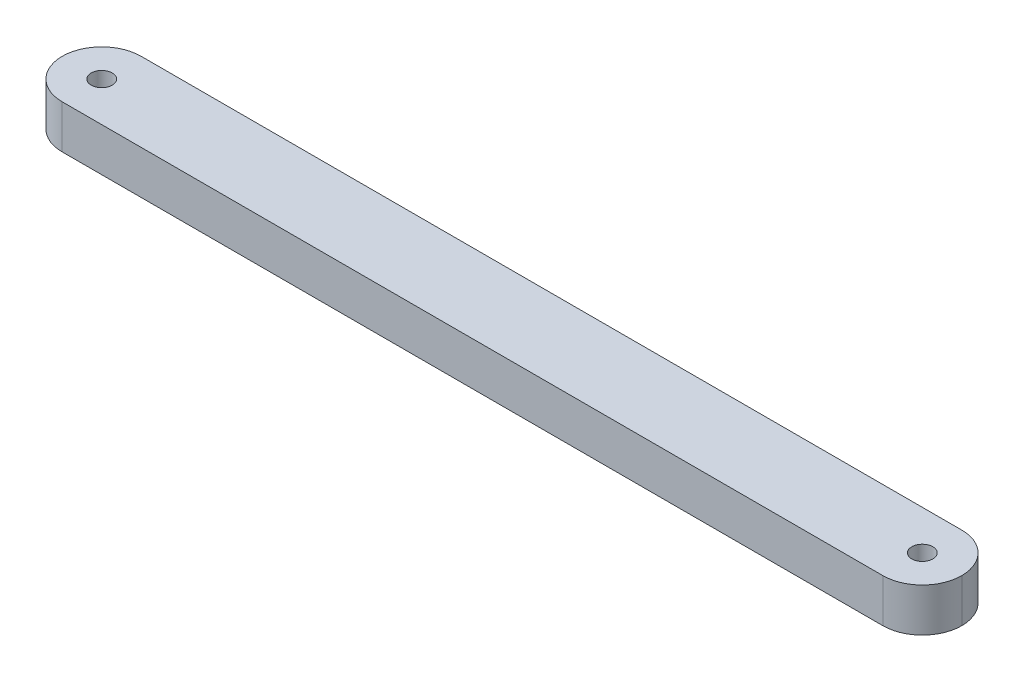
ISO-10303-21;
HEADER;
FILE_DESCRIPTION(('STEP AP214'),'2;1');
FILE_NAME('part.step','',(''),(''),'','','');
FILE_SCHEMA(('AUTOMOTIVE_DESIGN { 1 0 10303 214 1 1 1 1 }'));
ENDSEC;
DATA;
#1=APPLICATION_CONTEXT('core data for automotive mechanical design processes');
#2=APPLICATION_PROTOCOL_DEFINITION('international standard','automotive_design',2000,#1);
#3=PRODUCT_CONTEXT('',#1,'mechanical');
#4=PRODUCT('Part','Part','',(#3));
#5=PRODUCT_RELATED_PRODUCT_CATEGORY('part','',(#4));
#6=PRODUCT_DEFINITION_FORMATION('','',#4);
#7=PRODUCT_DEFINITION_CONTEXT('part definition',#1,'design');
#8=PRODUCT_DEFINITION('design','',#6,#7);
#9=PRODUCT_DEFINITION_SHAPE('','',#8);
#10=(LENGTH_UNIT() NAMED_UNIT(*) SI_UNIT(.MILLI.,.METRE.));
#11=(NAMED_UNIT(*) PLANE_ANGLE_UNIT() SI_UNIT($,.RADIAN.));
#12=(NAMED_UNIT(*) SI_UNIT($,.STERADIAN.) SOLID_ANGLE_UNIT());
#13=UNCERTAINTY_MEASURE_WITH_UNIT(LENGTH_MEASURE(1.E-05),#10,'distance_accuracy_value','');
#14=(GEOMETRIC_REPRESENTATION_CONTEXT(3) GLOBAL_UNCERTAINTY_ASSIGNED_CONTEXT((#13)) GLOBAL_UNIT_ASSIGNED_CONTEXT((#10,
#11,#12)) REPRESENTATION_CONTEXT('',''));
#15=CARTESIAN_POINT('',(0.,0.,0.));
#16=DIRECTION('',(0.,0.,1.));
#17=DIRECTION('',(1.,0.,0.));
#18=AXIS2_PLACEMENT_3D('',#15,#16,#17);
#19=CARTESIAN_POINT('',(0.,6.985,6.35000000000002));
#20=DIRECTION('',(0.,0.,-1.));
#21=DIRECTION('',(-1.,0.,0.));
#22=AXIS2_PLACEMENT_3D('',#19,#20,#21);
#23=PLANE('',#22);
#24=DIRECTION('',(1.,0.,0.));
#25=VECTOR('',#24,1.);
#26=CARTESIAN_POINT('',(0.,6.985,6.35000000000002));
#27=LINE('',#26,#25);
#28=CARTESIAN_POINT('',(-66.04,6.985,6.35000000000002));
#29=VERTEX_POINT('',#28);
#30=CARTESIAN_POINT('',(66.04,6.985,6.35000000000003));
#31=VERTEX_POINT('',#30);
#32=EDGE_CURVE('E122',#29,#31,#27,.T.);
#33=ORIENTED_EDGE('',*,*,#32,.F.);
#34=DIRECTION('',(0.,-1.,0.));
#35=VECTOR('',#34,1.);
#36=CARTESIAN_POINT('',(-66.04,0.,6.35000000000002));
#37=LINE('',#36,#35);
#38=CARTESIAN_POINT('',(-66.04,0.,6.35000000000002));
#39=VERTEX_POINT('',#38);
#40=EDGE_CURVE('E106',#29,#39,#37,.T.);
#41=ORIENTED_EDGE('',*,*,#40,.T.);
#42=DIRECTION('',(1.,0.,0.));
#43=VECTOR('',#42,1.);
#44=CARTESIAN_POINT('',(0.,0.,6.35000000000002));
#45=LINE('',#44,#43);
#46=CARTESIAN_POINT('',(66.04,0.,6.35000000000003));
#47=VERTEX_POINT('',#46);
#48=EDGE_CURVE('E119',#39,#47,#45,.T.);
#49=ORIENTED_EDGE('',*,*,#48,.T.);
#50=DIRECTION('',(0.,-1.,0.));
#51=VECTOR('',#50,1.);
#52=CARTESIAN_POINT('',(66.04,6.985,6.35000000000003));
#53=LINE('',#52,#51);
#54=EDGE_CURVE('E124',#47,#31,#53,.F.);
#55=ORIENTED_EDGE('',*,*,#54,.T.);
#56=EDGE_LOOP('',(#33,#41,#49,#55));
#57=FACE_BOUND('',#56,.T.);
#58=ADVANCED_FACE('F47',(#57),#23,.F.);
#59=CARTESIAN_POINT('',(0.,6.985,-6.34999999999999));
#60=DIRECTION('',(0.,0.,-1.));
#61=DIRECTION('',(-1.,0.,0.));
#62=AXIS2_PLACEMENT_3D('',#59,#60,#61);
#63=PLANE('',#62);
#64=DIRECTION('',(1.,0.,0.));
#65=VECTOR('',#64,1.);
#66=CARTESIAN_POINT('',(0.,6.985,-6.34999999999999));
#67=LINE('',#66,#65);
#68=CARTESIAN_POINT('',(-66.04,6.985,-6.34999999999999));
#69=VERTEX_POINT('',#68);
#70=CARTESIAN_POINT('',(66.04,6.985,-6.35));
#71=VERTEX_POINT('',#70);
#72=EDGE_CURVE('E172',#69,#71,#67,.T.);
#73=ORIENTED_EDGE('',*,*,#72,.T.);
#74=DIRECTION('',(0.,-1.,0.));
#75=VECTOR('',#74,1.);
#76=CARTESIAN_POINT('',(66.04,0.,-6.35));
#77=LINE('',#76,#75);
#78=CARTESIAN_POINT('',(66.04,0.,-6.35));
#79=VERTEX_POINT('',#78);
#80=EDGE_CURVE('E11',#71,#79,#77,.T.);
#81=ORIENTED_EDGE('',*,*,#80,.T.);
#82=DIRECTION('',(1.,0.,0.));
#83=VECTOR('',#82,1.);
#84=CARTESIAN_POINT('',(0.,0.,-6.34999999999999));
#85=LINE('',#84,#83);
#86=CARTESIAN_POINT('',(-66.04,0.,-6.34999999999999));
#87=VERTEX_POINT('',#86);
#88=EDGE_CURVE('E131',#87,#79,#85,.T.);
#89=ORIENTED_EDGE('',*,*,#88,.F.);
#90=DIRECTION('',(0.,-1.,0.));
#91=VECTOR('',#90,1.);
#92=CARTESIAN_POINT('',(-66.04,6.985,-6.34999999999999));
#93=LINE('',#92,#91);
#94=EDGE_CURVE('E57',#87,#69,#93,.F.);
#95=ORIENTED_EDGE('',*,*,#94,.T.);
#96=EDGE_LOOP('',(#73,#81,#89,#95));
#97=FACE_BOUND('',#96,.T.);
#98=ADVANCED_FACE('F171',(#97),#63,.T.);
#99=CARTESIAN_POINT('',(-66.04,6.985,0.));
#100=DIRECTION('',(0.,-1.,0.));
#101=DIRECTION('',(0.,0.,-1.));
#102=AXIS2_PLACEMENT_3D('',#99,#100,#101);
#103=CYLINDRICAL_SURFACE('',#102,1.7);
#104=CARTESIAN_POINT('',(-66.04,6.985,0.));
#105=DIRECTION('',(0.,1.,0.));
#106=DIRECTION('',(0.,0.,1.));
#107=AXIS2_PLACEMENT_3D('',#104,#105,#106);
#108=CIRCLE('',#107,1.7);
#109=CARTESIAN_POINT('',(-66.04,6.985,1.7));
#110=VERTEX_POINT('',#109);
#111=EDGE_CURVE('E178',#110,#110,#108,.T.);
#112=ORIENTED_EDGE('',*,*,#111,.T.);
#113=EDGE_LOOP('',(#112));
#114=FACE_BOUND('',#113,.T.);
#115=CARTESIAN_POINT('',(-66.04,0.,0.));
#116=DIRECTION('',(0.,1.,0.));
#117=DIRECTION('',(0.,0.,1.));
#118=AXIS2_PLACEMENT_3D('',#115,#116,#117);
#119=CIRCLE('',#118,1.7);
#120=CARTESIAN_POINT('',(-66.04,0.,1.7));
#121=VERTEX_POINT('',#120);
#122=EDGE_CURVE('E136',#121,#121,#119,.T.);
#123=ORIENTED_EDGE('',*,*,#122,.F.);
#124=EDGE_LOOP('',(#123));
#125=FACE_BOUND('',#124,.T.);
#126=ADVANCED_FACE('F195',(#114,#125),#103,.F.);
#127=CARTESIAN_POINT('',(66.04,6.985,0.));
#128=DIRECTION('',(0.,-1.,0.));
#129=DIRECTION('',(0.,0.,-1.));
#130=AXIS2_PLACEMENT_3D('',#127,#128,#129);
#131=CYLINDRICAL_SURFACE('',#130,1.7);
#132=CARTESIAN_POINT('',(66.04,6.985,0.));
#133=DIRECTION('',(0.,1.,0.));
#134=DIRECTION('',(0.,0.,1.));
#135=AXIS2_PLACEMENT_3D('',#132,#133,#134);
#136=CIRCLE('',#135,1.7);
#137=CARTESIAN_POINT('',(66.04,6.985,1.69999999999998));
#138=VERTEX_POINT('',#137);
#139=EDGE_CURVE('E139',#138,#138,#136,.F.);
#140=ORIENTED_EDGE('',*,*,#139,.F.);
#141=EDGE_LOOP('',(#140));
#142=FACE_BOUND('',#141,.T.);
#143=CARTESIAN_POINT('',(66.04,0.,0.));
#144=DIRECTION('',(0.,1.,0.));
#145=DIRECTION('',(0.,0.,1.));
#146=AXIS2_PLACEMENT_3D('',#143,#144,#145);
#147=CIRCLE('',#146,1.7);
#148=CARTESIAN_POINT('',(66.04,0.,1.69999999999998));
#149=VERTEX_POINT('',#148);
#150=EDGE_CURVE('E145',#149,#149,#147,.F.);
#151=ORIENTED_EDGE('',*,*,#150,.T.);
#152=EDGE_LOOP('',(#151));
#153=FACE_BOUND('',#152,.T.);
#154=ADVANCED_FACE('F192',(#142,#153),#131,.F.);
#155=CARTESIAN_POINT('',(0.,6.985,0.));
#156=DIRECTION('',(0.,1.,0.));
#157=DIRECTION('',(0.,0.,1.));
#158=AXIS2_PLACEMENT_3D('',#155,#156,#157);
#159=PLANE('',#158);
#160=ORIENTED_EDGE('',*,*,#32,.T.);
#161=CARTESIAN_POINT('',(66.04,6.985,0.));
#162=DIRECTION('',(0.,1.,0.));
#163=DIRECTION('',(0.,0.,1.));
#164=AXIS2_PLACEMENT_3D('',#161,#162,#163);
#165=CIRCLE('',#164,6.35);
#166=CARTESIAN_POINT('',(72.39,6.985,0.));
#167=VERTEX_POINT('',#166);
#168=EDGE_CURVE('E164',#31,#167,#165,.T.);
#169=ORIENTED_EDGE('',*,*,#168,.T.);
#170=CARTESIAN_POINT('',(66.04,6.985,0.));
#171=DIRECTION('',(0.,1.,0.));
#172=DIRECTION('',(0.,0.,1.));
#173=AXIS2_PLACEMENT_3D('',#170,#171,#172);
#174=CIRCLE('',#173,6.35);
#175=EDGE_CURVE('E71',#167,#71,#174,.T.);
#176=ORIENTED_EDGE('',*,*,#175,.T.);
#177=ORIENTED_EDGE('',*,*,#72,.F.);
#178=CARTESIAN_POINT('',(-66.04,6.985,0.));
#179=DIRECTION('',(0.,1.,0.));
#180=DIRECTION('',(0.,0.,1.));
#181=AXIS2_PLACEMENT_3D('',#178,#179,#180);
#182=CIRCLE('',#181,6.35);
#183=CARTESIAN_POINT('',(-72.39,6.985,0.));
#184=VERTEX_POINT('',#183);
#185=EDGE_CURVE('E65',#69,#184,#182,.T.);
#186=ORIENTED_EDGE('',*,*,#185,.T.);
#187=CARTESIAN_POINT('',(-66.04,6.985,0.));
#188=DIRECTION('',(0.,1.,0.));
#189=DIRECTION('',(0.,0.,1.));
#190=AXIS2_PLACEMENT_3D('',#187,#188,#189);
#191=CIRCLE('',#190,6.35);
#192=EDGE_CURVE('E159',#184,#29,#191,.T.);
#193=ORIENTED_EDGE('',*,*,#192,.T.);
#194=EDGE_LOOP('',(#160,#169,#176,#177,#186,#193));
#195=FACE_BOUND('',#194,.T.);
#196=ORIENTED_EDGE('',*,*,#111,.F.);
#197=EDGE_LOOP('',(#196));
#198=FACE_BOUND('',#197,.T.);
#199=ORIENTED_EDGE('',*,*,#139,.T.);
#200=EDGE_LOOP('',(#199));
#201=FACE_BOUND('',#200,.T.);
#202=ADVANCED_FACE('F175',(#195,#198,#201),#159,.T.);
#203=CARTESIAN_POINT('',(0.,0.,0.));
#204=DIRECTION('',(0.,1.,0.));
#205=DIRECTION('',(0.,0.,1.));
#206=AXIS2_PLACEMENT_3D('',#203,#204,#205);
#207=PLANE('',#206);
#208=CARTESIAN_POINT('',(66.04,0.,0.));
#209=DIRECTION('',(0.,1.,0.));
#210=DIRECTION('',(0.,0.,1.));
#211=AXIS2_PLACEMENT_3D('',#208,#209,#210);
#212=CIRCLE('',#211,6.35);
#213=CARTESIAN_POINT('',(72.39,0.,0.));
#214=VERTEX_POINT('',#213);
#215=EDGE_CURVE('E112',#79,#214,#212,.F.);
#216=ORIENTED_EDGE('',*,*,#215,.T.);
#217=CARTESIAN_POINT('',(66.04,0.,0.));
#218=DIRECTION('',(0.,1.,0.));
#219=DIRECTION('',(0.,0.,1.));
#220=AXIS2_PLACEMENT_3D('',#217,#218,#219);
#221=CIRCLE('',#220,6.35);
#222=EDGE_CURVE('E129',#214,#47,#221,.F.);
#223=ORIENTED_EDGE('',*,*,#222,.T.);
#224=ORIENTED_EDGE('',*,*,#48,.F.);
#225=CARTESIAN_POINT('',(-66.04,0.,0.));
#226=DIRECTION('',(0.,1.,0.));
#227=DIRECTION('',(0.,0.,1.));
#228=AXIS2_PLACEMENT_3D('',#225,#226,#227);
#229=CIRCLE('',#228,6.35);
#230=CARTESIAN_POINT('',(-72.39,0.,0.));
#231=VERTEX_POINT('',#230);
#232=EDGE_CURVE('E102',#39,#231,#229,.F.);
#233=ORIENTED_EDGE('',*,*,#232,.T.);
#234=CARTESIAN_POINT('',(-66.04,0.,0.));
#235=DIRECTION('',(0.,1.,0.));
#236=DIRECTION('',(0.,0.,1.));
#237=AXIS2_PLACEMENT_3D('',#234,#235,#236);
#238=CIRCLE('',#237,6.35);
#239=EDGE_CURVE('E113',#231,#87,#238,.F.);
#240=ORIENTED_EDGE('',*,*,#239,.T.);
#241=ORIENTED_EDGE('',*,*,#88,.T.);
#242=EDGE_LOOP('',(#216,#223,#224,#233,#240,#241));
#243=FACE_BOUND('',#242,.T.);
#244=ORIENTED_EDGE('',*,*,#122,.T.);
#245=EDGE_LOOP('',(#244));
#246=FACE_BOUND('',#245,.T.);
#247=ORIENTED_EDGE('',*,*,#150,.F.);
#248=EDGE_LOOP('',(#247));
#249=FACE_BOUND('',#248,.T.);
#250=ADVANCED_FACE('F126',(#243,#246,#249),#207,.F.);
#251=CARTESIAN_POINT('',(-66.04,6.985,0.));
#252=DIRECTION('',(0.,-1.,0.));
#253=DIRECTION('',(0.,0.,-1.));
#254=AXIS2_PLACEMENT_3D('',#251,#252,#253);
#255=CYLINDRICAL_SURFACE('',#254,6.35);
#256=DIRECTION('',(0.,-1.,0.));
#257=VECTOR('',#256,1.);
#258=CARTESIAN_POINT('',(-72.39,6.985,0.));
#259=LINE('',#258,#257);
#260=EDGE_CURVE('E107',#184,#231,#259,.T.);
#261=ORIENTED_EDGE('',*,*,#260,.F.);
#262=ORIENTED_EDGE('',*,*,#185,.F.);
#263=ORIENTED_EDGE('',*,*,#94,.F.);
#264=ORIENTED_EDGE('',*,*,#239,.F.);
#265=EDGE_LOOP('',(#261,#262,#263,#264));
#266=FACE_BOUND('',#265,.T.);
#267=ADVANCED_FACE('F180',(#266),#255,.T.);
#268=CARTESIAN_POINT('',(-66.04,6.985,0.));
#269=DIRECTION('',(0.,1.,0.));
#270=DIRECTION('',(0.,0.,1.));
#271=AXIS2_PLACEMENT_3D('',#268,#269,#270);
#272=CYLINDRICAL_SURFACE('',#271,6.35);
#273=ORIENTED_EDGE('',*,*,#192,.F.);
#274=ORIENTED_EDGE('',*,*,#260,.T.);
#275=ORIENTED_EDGE('',*,*,#232,.F.);
#276=ORIENTED_EDGE('',*,*,#40,.F.);
#277=EDGE_LOOP('',(#273,#274,#275,#276));
#278=FACE_BOUND('',#277,.T.);
#279=ADVANCED_FACE('F105',(#278),#272,.T.);
#280=CARTESIAN_POINT('',(66.04,6.985,0.));
#281=DIRECTION('',(0.,1.,0.));
#282=DIRECTION('',(0.,0.,1.));
#283=AXIS2_PLACEMENT_3D('',#280,#281,#282);
#284=CYLINDRICAL_SURFACE('',#283,6.35);
#285=ORIENTED_EDGE('',*,*,#80,.F.);
#286=ORIENTED_EDGE('',*,*,#175,.F.);
#287=DIRECTION('',(0.,-1.,0.));
#288=VECTOR('',#287,1.);
#289=CARTESIAN_POINT('',(72.39,6.985,0.));
#290=LINE('',#289,#288);
#291=EDGE_CURVE('E51',#214,#167,#290,.F.);
#292=ORIENTED_EDGE('',*,*,#291,.F.);
#293=ORIENTED_EDGE('',*,*,#215,.F.);
#294=EDGE_LOOP('',(#285,#286,#292,#293));
#295=FACE_BOUND('',#294,.T.);
#296=ADVANCED_FACE('F49',(#295),#284,.T.);
#297=CARTESIAN_POINT('',(66.04,6.985,0.));
#298=DIRECTION('',(0.,-1.,0.));
#299=DIRECTION('',(0.,0.,-1.));
#300=AXIS2_PLACEMENT_3D('',#297,#298,#299);
#301=CYLINDRICAL_SURFACE('',#300,6.35);
#302=ORIENTED_EDGE('',*,*,#168,.F.);
#303=ORIENTED_EDGE('',*,*,#54,.F.);
#304=ORIENTED_EDGE('',*,*,#222,.F.);
#305=ORIENTED_EDGE('',*,*,#291,.T.);
#306=EDGE_LOOP('',(#302,#303,#304,#305));
#307=FACE_BOUND('',#306,.T.);
#308=ADVANCED_FACE('F216',(#307),#301,.T.);
#309=CLOSED_SHELL('',(#58,#98,#126,#154,#202,#250,#267,#279,#296,#308));
#310=MANIFOLD_SOLID_BREP('B2',#309);
#311=ADVANCED_BREP_SHAPE_REPRESENTATION('',(#18,#310),#14);
#312=SHAPE_DEFINITION_REPRESENTATION(#9,#311);
ENDSEC;
END-ISO-10303-21;
